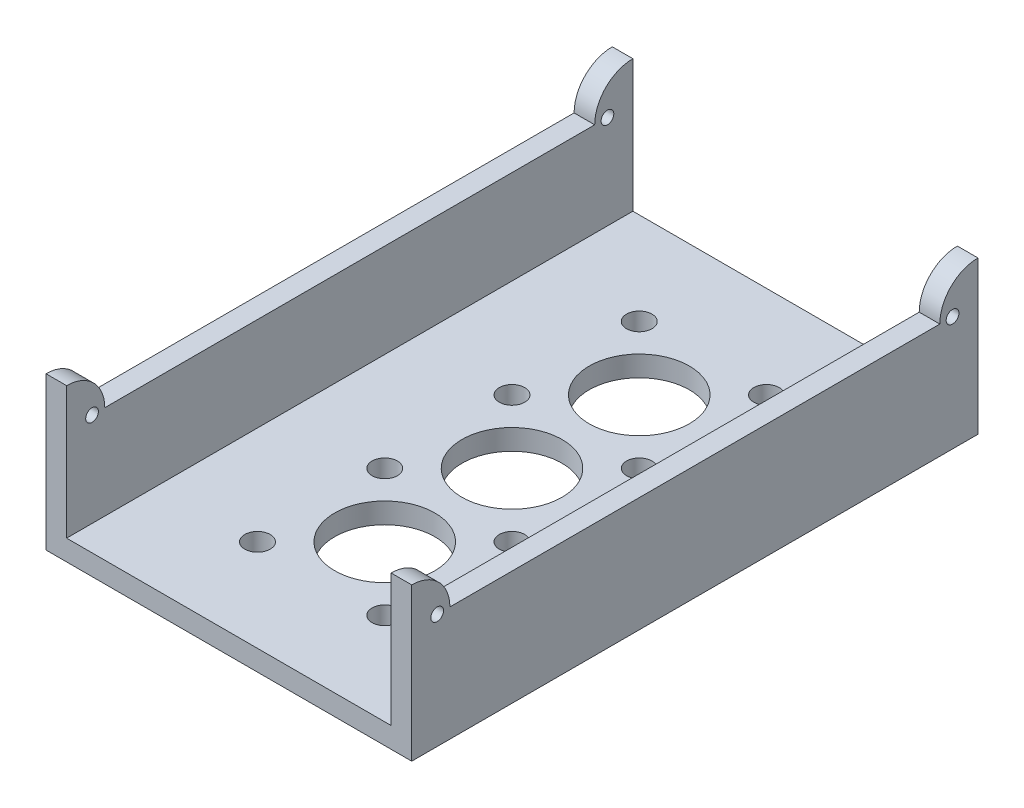
ISO-10303-21;
HEADER;
FILE_DESCRIPTION(('STEP AP214'),'2;1');
FILE_NAME('part.step','',(''),(''),'','','');
FILE_SCHEMA(('AUTOMOTIVE_DESIGN { 1 0 10303 214 1 1 1 1 }'));
ENDSEC;
DATA;
#1=APPLICATION_CONTEXT('core data for automotive mechanical design processes');
#2=APPLICATION_PROTOCOL_DEFINITION('international standard','automotive_design',2000,#1);
#3=PRODUCT_CONTEXT('',#1,'mechanical');
#4=PRODUCT('Part','Part','',(#3));
#5=PRODUCT_RELATED_PRODUCT_CATEGORY('part','',(#4));
#6=PRODUCT_DEFINITION_FORMATION('','',#4);
#7=PRODUCT_DEFINITION_CONTEXT('part definition',#1,'design');
#8=PRODUCT_DEFINITION('design','',#6,#7);
#9=PRODUCT_DEFINITION_SHAPE('','',#8);
#10=(LENGTH_UNIT() NAMED_UNIT(*) SI_UNIT(.MILLI.,.METRE.));
#11=(NAMED_UNIT(*) PLANE_ANGLE_UNIT() SI_UNIT($,.RADIAN.));
#12=(NAMED_UNIT(*) SI_UNIT($,.STERADIAN.) SOLID_ANGLE_UNIT());
#13=UNCERTAINTY_MEASURE_WITH_UNIT(LENGTH_MEASURE(1.E-05),#10,'distance_accuracy_value','');
#14=(GEOMETRIC_REPRESENTATION_CONTEXT(3) GLOBAL_UNCERTAINTY_ASSIGNED_CONTEXT((#13)) GLOBAL_UNIT_ASSIGNED_CONTEXT((#10,
#11,#12)) REPRESENTATION_CONTEXT('',''));
#15=CARTESIAN_POINT('',(0.,0.,0.));
#16=DIRECTION('',(0.,0.,1.));
#17=DIRECTION('',(1.,0.,0.));
#18=AXIS2_PLACEMENT_3D('',#15,#16,#17);
#19=CARTESIAN_POINT('',(14.37,0.,44.5));
#20=DIRECTION('',(1.,0.,0.));
#21=DIRECTION('',(0.,0.,-1.));
#22=AXIS2_PLACEMENT_3D('',#19,#20,#21);
#23=PLANE('',#22);
#24=CARTESIAN_POINT('',(14.37,9.,2.));
#25=DIRECTION('',(-1.,0.,0.));
#26=DIRECTION('',(0.,0.,1.));
#27=AXIS2_PLACEMENT_3D('',#24,#25,#26);
#28=CIRCLE('',#27,0.499999999999999);
#29=CARTESIAN_POINT('',(14.37,9.,2.5));
#30=VERTEX_POINT('',#29);
#31=EDGE_CURVE('E267',#30,#30,#28,.T.);
#32=ORIENTED_EDGE('',*,*,#31,.T.);
#33=EDGE_LOOP('',(#32));
#34=FACE_BOUND('',#33,.T.);
#35=CARTESIAN_POINT('',(14.37,9.,42.5));
#36=DIRECTION('',(-1.,0.,0.));
#37=DIRECTION('',(0.,0.,1.));
#38=AXIS2_PLACEMENT_3D('',#35,#36,#37);
#39=CIRCLE('',#38,0.499999999999999);
#40=CARTESIAN_POINT('',(14.37,9.,43.));
#41=VERTEX_POINT('',#40);
#42=EDGE_CURVE('E268',#41,#41,#39,.T.);
#43=ORIENTED_EDGE('',*,*,#42,.T.);
#44=EDGE_LOOP('',(#43));
#45=FACE_BOUND('',#44,.T.);
#46=DIRECTION('',(0.,-1.,0.));
#47=VECTOR('',#46,1.);
#48=CARTESIAN_POINT('',(14.37,0.,0.));
#49=LINE('',#48,#47);
#50=CARTESIAN_POINT('',(14.37,12.,0.));
#51=VERTEX_POINT('',#50);
#52=CARTESIAN_POINT('',(14.37,0.,0.));
#53=VERTEX_POINT('',#52);
#54=EDGE_CURVE('E102',#51,#53,#49,.T.);
#55=ORIENTED_EDGE('',*,*,#54,.F.);
#56=CARTESIAN_POINT('',(14.37,9.,0.));
#57=DIRECTION('',(1.,0.,0.));
#58=DIRECTION('',(0.,0.,-1.));
#59=AXIS2_PLACEMENT_3D('',#56,#57,#58);
#60=CIRCLE('',#59,3.);
#61=CARTESIAN_POINT('',(14.37,9.,3.));
#62=VERTEX_POINT('',#61);
#63=EDGE_CURVE('E254',#51,#62,#60,.T.);
#64=ORIENTED_EDGE('',*,*,#63,.T.);
#65=DIRECTION('',(0.,0.,1.));
#66=VECTOR('',#65,1.);
#67=CARTESIAN_POINT('',(14.37,9.,3.));
#68=LINE('',#67,#66);
#69=CARTESIAN_POINT('',(14.37,9.,41.5));
#70=VERTEX_POINT('',#69);
#71=EDGE_CURVE('E133',#62,#70,#68,.T.);
#72=ORIENTED_EDGE('',*,*,#71,.T.);
#73=CARTESIAN_POINT('',(14.37,9.,44.5));
#74=DIRECTION('',(1.,0.,0.));
#75=DIRECTION('',(0.,0.,-1.));
#76=AXIS2_PLACEMENT_3D('',#73,#74,#75);
#77=CIRCLE('',#76,3.);
#78=CARTESIAN_POINT('',(14.37,12.,44.5));
#79=VERTEX_POINT('',#78);
#80=EDGE_CURVE('E257',#70,#79,#77,.T.);
#81=ORIENTED_EDGE('',*,*,#80,.T.);
#82=DIRECTION('',(0.,-1.,0.));
#83=VECTOR('',#82,1.);
#84=CARTESIAN_POINT('',(14.37,0.,44.5));
#85=LINE('',#84,#83);
#86=CARTESIAN_POINT('',(14.37,0.,44.5));
#87=VERTEX_POINT('',#86);
#88=EDGE_CURVE('E144',#79,#87,#85,.T.);
#89=ORIENTED_EDGE('',*,*,#88,.T.);
#90=DIRECTION('',(0.,0.,-1.));
#91=VECTOR('',#90,1.);
#92=CARTESIAN_POINT('',(14.37,0.,44.5));
#93=LINE('',#92,#91);
#94=EDGE_CURVE('E158',#87,#53,#93,.T.);
#95=ORIENTED_EDGE('',*,*,#94,.T.);
#96=EDGE_LOOP('',(#55,#64,#72,#81,#89,#95));
#97=FACE_BOUND('',#96,.T.);
#98=ADVANCED_FACE('F32',(#34,#45,#97),#23,.T.);
#99=CARTESIAN_POINT('',(12.75,12.,44.5));
#100=DIRECTION('',(-1.,0.,0.));
#101=DIRECTION('',(0.,-1.,0.));
#102=AXIS2_PLACEMENT_3D('',#99,#100,#101);
#103=PLANE('',#102);
#104=CARTESIAN_POINT('',(12.75,9.,2.));
#105=DIRECTION('',(-1.,0.,0.));
#106=DIRECTION('',(0.,-1.,0.));
#107=AXIS2_PLACEMENT_3D('',#104,#105,#106);
#108=CIRCLE('',#107,0.499999999999999);
#109=CARTESIAN_POINT('',(12.75,8.5,2.));
#110=VERTEX_POINT('',#109);
#111=EDGE_CURVE('E258',#110,#110,#108,.F.);
#112=ORIENTED_EDGE('',*,*,#111,.T.);
#113=EDGE_LOOP('',(#112));
#114=FACE_BOUND('',#113,.T.);
#115=CARTESIAN_POINT('',(12.75,9.,42.5));
#116=DIRECTION('',(-1.,0.,0.));
#117=DIRECTION('',(0.,-1.,0.));
#118=AXIS2_PLACEMENT_3D('',#115,#116,#117);
#119=CIRCLE('',#118,0.499999999999999);
#120=CARTESIAN_POINT('',(12.75,8.5,42.5));
#121=VERTEX_POINT('',#120);
#122=EDGE_CURVE('E264',#121,#121,#119,.F.);
#123=ORIENTED_EDGE('',*,*,#122,.T.);
#124=EDGE_LOOP('',(#123));
#125=FACE_BOUND('',#124,.T.);
#126=DIRECTION('',(0.,0.,-1.));
#127=VECTOR('',#126,1.);
#128=CARTESIAN_POINT('',(12.75,9.,44.5));
#129=LINE('',#128,#127);
#130=CARTESIAN_POINT('',(12.75,9.,41.5));
#131=VERTEX_POINT('',#130);
#132=CARTESIAN_POINT('',(12.75,9.,3.));
#133=VERTEX_POINT('',#132);
#134=EDGE_CURVE('E40',#131,#133,#129,.T.);
#135=ORIENTED_EDGE('',*,*,#134,.T.);
#136=CARTESIAN_POINT('',(12.75,9.,0.));
#137=DIRECTION('',(-1.,0.,0.));
#138=DIRECTION('',(0.,-1.,0.));
#139=AXIS2_PLACEMENT_3D('',#136,#137,#138);
#140=CIRCLE('',#139,3.);
#141=CARTESIAN_POINT('',(12.75,12.,0.));
#142=VERTEX_POINT('',#141);
#143=EDGE_CURVE('E11',#133,#142,#140,.T.);
#144=ORIENTED_EDGE('',*,*,#143,.T.);
#145=DIRECTION('',(0.,1.,0.));
#146=VECTOR('',#145,1.);
#147=CARTESIAN_POINT('',(12.75,12.,0.));
#148=LINE('',#147,#146);
#149=CARTESIAN_POINT('',(12.75,1.62,0.));
#150=VERTEX_POINT('',#149);
#151=EDGE_CURVE('E148',#150,#142,#148,.T.);
#152=ORIENTED_EDGE('',*,*,#151,.F.);
#153=DIRECTION('',(0.,0.,-1.));
#154=VECTOR('',#153,1.);
#155=CARTESIAN_POINT('',(12.75,1.62,44.5));
#156=LINE('',#155,#154);
#157=CARTESIAN_POINT('',(12.75,1.62,44.5));
#158=VERTEX_POINT('',#157);
#159=EDGE_CURVE('E152',#158,#150,#156,.T.);
#160=ORIENTED_EDGE('',*,*,#159,.F.);
#161=DIRECTION('',(0.,1.,0.));
#162=VECTOR('',#161,1.);
#163=CARTESIAN_POINT('',(12.75,12.,44.5));
#164=LINE('',#163,#162);
#165=CARTESIAN_POINT('',(12.75,12.,44.5));
#166=VERTEX_POINT('',#165);
#167=EDGE_CURVE('E151',#158,#166,#164,.T.);
#168=ORIENTED_EDGE('',*,*,#167,.T.);
#169=CARTESIAN_POINT('',(12.75,9.,44.5));
#170=DIRECTION('',(-1.,0.,0.));
#171=DIRECTION('',(0.,-1.,0.));
#172=AXIS2_PLACEMENT_3D('',#169,#170,#171);
#173=CIRCLE('',#172,3.);
#174=EDGE_CURVE('E111',#166,#131,#173,.T.);
#175=ORIENTED_EDGE('',*,*,#174,.T.);
#176=EDGE_LOOP('',(#135,#144,#152,#160,#168,#175));
#177=FACE_BOUND('',#176,.T.);
#178=ADVANCED_FACE('F116',(#114,#125,#177),#103,.T.);
#179=CARTESIAN_POINT('',(-12.75,1.62,44.5));
#180=DIRECTION('',(0.,-1.,0.));
#181=DIRECTION('',(1.,0.,0.));
#182=AXIS2_PLACEMENT_3D('',#179,#180,#181);
#183=PLANE('',#182);
#184=CARTESIAN_POINT('',(-5.,1.62,7.24999999999998));
#185=DIRECTION('',(0.,-1.,0.));
#186=DIRECTION('',(1.,0.,0.));
#187=AXIS2_PLACEMENT_3D('',#184,#185,#186);
#188=CIRCLE('',#187,1.);
#189=CARTESIAN_POINT('',(-4.,1.62,7.24999999999998));
#190=VERTEX_POINT('',#189);
#191=EDGE_CURVE('E279',#190,#190,#188,.F.);
#192=ORIENTED_EDGE('',*,*,#191,.F.);
#193=EDGE_LOOP('',(#192));
#194=FACE_BOUND('',#193,.T.);
#195=CARTESIAN_POINT('',(5.,1.62,7.24999999999998));
#196=DIRECTION('',(0.,-1.,0.));
#197=DIRECTION('',(1.,0.,0.));
#198=AXIS2_PLACEMENT_3D('',#195,#196,#197);
#199=CIRCLE('',#198,1.);
#200=CARTESIAN_POINT('',(6.,1.62,7.24999999999998));
#201=VERTEX_POINT('',#200);
#202=EDGE_CURVE('E282',#201,#201,#199,.F.);
#203=ORIENTED_EDGE('',*,*,#202,.F.);
#204=EDGE_LOOP('',(#203));
#205=FACE_BOUND('',#204,.T.);
#206=CARTESIAN_POINT('',(5.,1.62,17.25));
#207=DIRECTION('',(0.,-1.,0.));
#208=DIRECTION('',(1.,0.,0.));
#209=AXIS2_PLACEMENT_3D('',#206,#207,#208);
#210=CIRCLE('',#209,1.);
#211=CARTESIAN_POINT('',(6.,1.62,17.25));
#212=VERTEX_POINT('',#211);
#213=EDGE_CURVE('E285',#212,#212,#210,.F.);
#214=ORIENTED_EDGE('',*,*,#213,.F.);
#215=EDGE_LOOP('',(#214));
#216=FACE_BOUND('',#215,.T.);
#217=CARTESIAN_POINT('',(-5.,1.62,17.25));
#218=DIRECTION('',(0.,-1.,0.));
#219=DIRECTION('',(1.,0.,0.));
#220=AXIS2_PLACEMENT_3D('',#217,#218,#219);
#221=CIRCLE('',#220,1.);
#222=CARTESIAN_POINT('',(-4.,1.62,17.25));
#223=VERTEX_POINT('',#222);
#224=EDGE_CURVE('E288',#223,#223,#221,.F.);
#225=ORIENTED_EDGE('',*,*,#224,.F.);
#226=EDGE_LOOP('',(#225));
#227=FACE_BOUND('',#226,.T.);
#228=CARTESIAN_POINT('',(1.06244632494249E-13,1.62,22.25));
#229=DIRECTION('',(0.,-1.,0.));
#230=DIRECTION('',(1.,0.,0.));
#231=AXIS2_PLACEMENT_3D('',#228,#229,#230);
#232=CIRCLE('',#231,3.935);
#233=CARTESIAN_POINT('',(3.93500000000011,1.62,22.25));
#234=VERTEX_POINT('',#233);
#235=EDGE_CURVE('E291',#234,#234,#232,.F.);
#236=ORIENTED_EDGE('',*,*,#235,.F.);
#237=EDGE_LOOP('',(#236));
#238=FACE_BOUND('',#237,.T.);
#239=CARTESIAN_POINT('',(5.00000000000011,1.62,27.25));
#240=DIRECTION('',(0.,-1.,0.));
#241=DIRECTION('',(1.,0.,0.));
#242=AXIS2_PLACEMENT_3D('',#239,#240,#241);
#243=CIRCLE('',#242,1.);
#244=CARTESIAN_POINT('',(6.00000000000011,1.62,27.25));
#245=VERTEX_POINT('',#244);
#246=EDGE_CURVE('E294',#245,#245,#243,.F.);
#247=ORIENTED_EDGE('',*,*,#246,.F.);
#248=EDGE_LOOP('',(#247));
#249=FACE_BOUND('',#248,.T.);
#250=CARTESIAN_POINT('',(-4.99999999999989,1.62,27.25));
#251=DIRECTION('',(0.,-1.,0.));
#252=DIRECTION('',(1.,0.,0.));
#253=AXIS2_PLACEMENT_3D('',#250,#251,#252);
#254=CIRCLE('',#253,1.);
#255=CARTESIAN_POINT('',(-3.99999999999989,1.62,27.25));
#256=VERTEX_POINT('',#255);
#257=EDGE_CURVE('E297',#256,#256,#254,.F.);
#258=ORIENTED_EDGE('',*,*,#257,.F.);
#259=EDGE_LOOP('',(#258));
#260=FACE_BOUND('',#259,.T.);
#261=CARTESIAN_POINT('',(2.10989072659543E-13,1.62,32.25));
#262=DIRECTION('',(0.,-1.,0.));
#263=DIRECTION('',(1.,0.,0.));
#264=AXIS2_PLACEMENT_3D('',#261,#262,#263);
#265=CIRCLE('',#264,3.935);
#266=CARTESIAN_POINT('',(3.93500000000021,1.62,32.25));
#267=VERTEX_POINT('',#266);
#268=EDGE_CURVE('E300',#267,#267,#265,.F.);
#269=ORIENTED_EDGE('',*,*,#268,.F.);
#270=EDGE_LOOP('',(#269));
#271=FACE_BOUND('',#270,.T.);
#272=CARTESIAN_POINT('',(5.00000000000021,1.62,37.25));
#273=DIRECTION('',(0.,-1.,0.));
#274=DIRECTION('',(1.,0.,0.));
#275=AXIS2_PLACEMENT_3D('',#272,#273,#274);
#276=CIRCLE('',#275,1.);
#277=CARTESIAN_POINT('',(6.00000000000021,1.62,37.25));
#278=VERTEX_POINT('',#277);
#279=EDGE_CURVE('E303',#278,#278,#276,.F.);
#280=ORIENTED_EDGE('',*,*,#279,.F.);
#281=EDGE_LOOP('',(#280));
#282=FACE_BOUND('',#281,.T.);
#283=CARTESIAN_POINT('',(-4.99999999999979,1.62,37.25));
#284=DIRECTION('',(0.,-1.,0.));
#285=DIRECTION('',(1.,0.,0.));
#286=AXIS2_PLACEMENT_3D('',#283,#284,#285);
#287=CIRCLE('',#286,1.);
#288=CARTESIAN_POINT('',(-3.99999999999979,1.62,37.25));
#289=VERTEX_POINT('',#288);
#290=EDGE_CURVE('E306',#289,#289,#287,.F.);
#291=ORIENTED_EDGE('',*,*,#290,.F.);
#292=EDGE_LOOP('',(#291));
#293=FACE_BOUND('',#292,.T.);
#294=CARTESIAN_POINT('',(0.,1.62,12.25));
#295=DIRECTION('',(0.,-1.,0.));
#296=DIRECTION('',(1.,0.,0.));
#297=AXIS2_PLACEMENT_3D('',#294,#295,#296);
#298=CIRCLE('',#297,3.935);
#299=CARTESIAN_POINT('',(3.935,1.62,12.25));
#300=VERTEX_POINT('',#299);
#301=EDGE_CURVE('E271',#300,#300,#298,.F.);
#302=ORIENTED_EDGE('',*,*,#301,.F.);
#303=EDGE_LOOP('',(#302));
#304=FACE_BOUND('',#303,.T.);
#305=DIRECTION('',(-1.,0.,0.));
#306=VECTOR('',#305,1.);
#307=CARTESIAN_POINT('',(-12.75,1.62,0.));
#308=LINE('',#307,#306);
#309=CARTESIAN_POINT('',(-12.75,1.62,0.));
#310=VERTEX_POINT('',#309);
#311=EDGE_CURVE('E193',#150,#310,#308,.T.);
#312=ORIENTED_EDGE('',*,*,#311,.T.);
#313=DIRECTION('',(0.,0.,-1.));
#314=VECTOR('',#313,1.);
#315=CARTESIAN_POINT('',(-12.75,1.62,44.5));
#316=LINE('',#315,#314);
#317=CARTESIAN_POINT('',(-12.75,1.62,44.5));
#318=VERTEX_POINT('',#317);
#319=EDGE_CURVE('E95',#318,#310,#316,.T.);
#320=ORIENTED_EDGE('',*,*,#319,.F.);
#321=DIRECTION('',(-1.,0.,0.));
#322=VECTOR('',#321,1.);
#323=CARTESIAN_POINT('',(-12.75,1.62,44.5));
#324=LINE('',#323,#322);
#325=EDGE_CURVE('E103',#158,#318,#324,.T.);
#326=ORIENTED_EDGE('',*,*,#325,.F.);
#327=ORIENTED_EDGE('',*,*,#159,.T.);
#328=EDGE_LOOP('',(#312,#320,#326,#327));
#329=FACE_BOUND('',#328,.T.);
#330=ADVANCED_FACE('F34',(#194,#205,#216,#227,#238,#249,#260,#271,#282,#293,#304,#329),#183,.F.);
#331=CARTESIAN_POINT('',(-12.75,12.,44.5));
#332=DIRECTION('',(-1.,0.,0.));
#333=DIRECTION('',(0.,-1.,0.));
#334=AXIS2_PLACEMENT_3D('',#331,#332,#333);
#335=PLANE('',#334);
#336=CARTESIAN_POINT('',(-12.75,9.,2.));
#337=DIRECTION('',(-1.,0.,0.));
#338=DIRECTION('',(0.,-1.,0.));
#339=AXIS2_PLACEMENT_3D('',#336,#337,#338);
#340=CIRCLE('',#339,0.499999999999999);
#341=CARTESIAN_POINT('',(-12.75,8.5,2.));
#342=VERTEX_POINT('',#341);
#343=EDGE_CURVE('E169',#342,#342,#340,.T.);
#344=ORIENTED_EDGE('',*,*,#343,.T.);
#345=EDGE_LOOP('',(#344));
#346=FACE_BOUND('',#345,.T.);
#347=CARTESIAN_POINT('',(-12.75,9.,42.5));
#348=DIRECTION('',(-1.,0.,0.));
#349=DIRECTION('',(0.,-1.,0.));
#350=AXIS2_PLACEMENT_3D('',#347,#348,#349);
#351=CIRCLE('',#350,0.499999999999999);
#352=CARTESIAN_POINT('',(-12.75,8.5,42.5));
#353=VERTEX_POINT('',#352);
#354=EDGE_CURVE('E164',#353,#353,#351,.T.);
#355=ORIENTED_EDGE('',*,*,#354,.T.);
#356=EDGE_LOOP('',(#355));
#357=FACE_BOUND('',#356,.T.);
#358=DIRECTION('',(0.,1.,0.));
#359=VECTOR('',#358,1.);
#360=CARTESIAN_POINT('',(-12.75,12.,0.));
#361=LINE('',#360,#359);
#362=CARTESIAN_POINT('',(-12.75,12.,0.));
#363=VERTEX_POINT('',#362);
#364=EDGE_CURVE('E202',#310,#363,#361,.T.);
#365=ORIENTED_EDGE('',*,*,#364,.T.);
#366=CARTESIAN_POINT('',(-12.75,9.,0.));
#367=DIRECTION('',(-1.,0.,0.));
#368=DIRECTION('',(0.,-1.,0.));
#369=AXIS2_PLACEMENT_3D('',#366,#367,#368);
#370=CIRCLE('',#369,3.);
#371=CARTESIAN_POINT('',(-12.75,9.,3.));
#372=VERTEX_POINT('',#371);
#373=EDGE_CURVE('E183',#363,#372,#370,.F.);
#374=ORIENTED_EDGE('',*,*,#373,.T.);
#375=DIRECTION('',(0.,0.,1.));
#376=VECTOR('',#375,1.);
#377=CARTESIAN_POINT('',(-12.75,9.,44.5));
#378=LINE('',#377,#376);
#379=CARTESIAN_POINT('',(-12.75,9.,41.5));
#380=VERTEX_POINT('',#379);
#381=EDGE_CURVE('E191',#372,#380,#378,.T.);
#382=ORIENTED_EDGE('',*,*,#381,.T.);
#383=CARTESIAN_POINT('',(-12.75,9.,44.5));
#384=DIRECTION('',(-1.,0.,0.));
#385=DIRECTION('',(0.,-1.,0.));
#386=AXIS2_PLACEMENT_3D('',#383,#384,#385);
#387=CIRCLE('',#386,3.);
#388=CARTESIAN_POINT('',(-12.75,12.,44.5));
#389=VERTEX_POINT('',#388);
#390=EDGE_CURVE('E188',#380,#389,#387,.F.);
#391=ORIENTED_EDGE('',*,*,#390,.T.);
#392=DIRECTION('',(0.,1.,0.));
#393=VECTOR('',#392,1.);
#394=CARTESIAN_POINT('',(-12.75,12.,44.5));
#395=LINE('',#394,#393);
#396=EDGE_CURVE('E105',#318,#389,#395,.T.);
#397=ORIENTED_EDGE('',*,*,#396,.F.);
#398=ORIENTED_EDGE('',*,*,#319,.T.);
#399=EDGE_LOOP('',(#365,#374,#382,#391,#397,#398));
#400=FACE_BOUND('',#399,.T.);
#401=ADVANCED_FACE('F215',(#346,#357,#400),#335,.F.);
#402=CARTESIAN_POINT('',(-14.37,0.,44.5));
#403=DIRECTION('',(1.,0.,0.));
#404=DIRECTION('',(0.,0.,-1.));
#405=AXIS2_PLACEMENT_3D('',#402,#403,#404);
#406=PLANE('',#405);
#407=CARTESIAN_POINT('',(-14.37,9.,2.));
#408=DIRECTION('',(-1.,0.,0.));
#409=DIRECTION('',(0.,0.,1.));
#410=AXIS2_PLACEMENT_3D('',#407,#408,#409);
#411=CIRCLE('',#410,0.499999999999999);
#412=CARTESIAN_POINT('',(-14.37,9.,2.5));
#413=VERTEX_POINT('',#412);
#414=EDGE_CURVE('E161',#413,#413,#411,.T.);
#415=ORIENTED_EDGE('',*,*,#414,.F.);
#416=EDGE_LOOP('',(#415));
#417=FACE_BOUND('',#416,.T.);
#418=CARTESIAN_POINT('',(-14.37,9.,42.5));
#419=DIRECTION('',(-1.,0.,0.));
#420=DIRECTION('',(0.,0.,1.));
#421=AXIS2_PLACEMENT_3D('',#418,#419,#420);
#422=CIRCLE('',#421,0.499999999999999);
#423=CARTESIAN_POINT('',(-14.37,9.,43.));
#424=VERTEX_POINT('',#423);
#425=EDGE_CURVE('E160',#424,#424,#422,.T.);
#426=ORIENTED_EDGE('',*,*,#425,.F.);
#427=EDGE_LOOP('',(#426));
#428=FACE_BOUND('',#427,.T.);
#429=DIRECTION('',(0.,0.,1.));
#430=VECTOR('',#429,1.);
#431=CARTESIAN_POINT('',(-14.37,9.,3.));
#432=LINE('',#431,#430);
#433=CARTESIAN_POINT('',(-14.37,9.,3.));
#434=VERTEX_POINT('',#433);
#435=CARTESIAN_POINT('',(-14.37,9.,41.5));
#436=VERTEX_POINT('',#435);
#437=EDGE_CURVE('E173',#434,#436,#432,.T.);
#438=ORIENTED_EDGE('',*,*,#437,.F.);
#439=CARTESIAN_POINT('',(-14.37,9.,0.));
#440=DIRECTION('',(1.,0.,0.));
#441=DIRECTION('',(0.,0.,-1.));
#442=AXIS2_PLACEMENT_3D('',#439,#440,#441);
#443=CIRCLE('',#442,3.);
#444=CARTESIAN_POINT('',(-14.37,12.,0.));
#445=VERTEX_POINT('',#444);
#446=EDGE_CURVE('E81',#445,#434,#443,.T.);
#447=ORIENTED_EDGE('',*,*,#446,.F.);
#448=DIRECTION('',(0.,-1.,0.));
#449=VECTOR('',#448,1.);
#450=CARTESIAN_POINT('',(-14.37,0.,0.));
#451=LINE('',#450,#449);
#452=CARTESIAN_POINT('',(-14.37,0.,0.));
#453=VERTEX_POINT('',#452);
#454=EDGE_CURVE('E73',#445,#453,#451,.T.);
#455=ORIENTED_EDGE('',*,*,#454,.T.);
#456=DIRECTION('',(0.,0.,-1.));
#457=VECTOR('',#456,1.);
#458=CARTESIAN_POINT('',(-14.37,0.,44.5));
#459=LINE('',#458,#457);
#460=CARTESIAN_POINT('',(-14.37,0.,44.5));
#461=VERTEX_POINT('',#460);
#462=EDGE_CURVE('E77',#461,#453,#459,.T.);
#463=ORIENTED_EDGE('',*,*,#462,.F.);
#464=DIRECTION('',(0.,-1.,0.));
#465=VECTOR('',#464,1.);
#466=CARTESIAN_POINT('',(-14.37,0.,44.5));
#467=LINE('',#466,#465);
#468=CARTESIAN_POINT('',(-14.37,12.,44.5));
#469=VERTEX_POINT('',#468);
#470=EDGE_CURVE('E56',#469,#461,#467,.T.);
#471=ORIENTED_EDGE('',*,*,#470,.F.);
#472=CARTESIAN_POINT('',(-14.37,9.,44.5));
#473=DIRECTION('',(1.,0.,0.));
#474=DIRECTION('',(0.,0.,-1.));
#475=AXIS2_PLACEMENT_3D('',#472,#473,#474);
#476=CIRCLE('',#475,3.);
#477=EDGE_CURVE('E176',#436,#469,#476,.T.);
#478=ORIENTED_EDGE('',*,*,#477,.F.);
#479=EDGE_LOOP('',(#438,#447,#455,#463,#471,#478));
#480=FACE_BOUND('',#479,.T.);
#481=ADVANCED_FACE('F76',(#417,#428,#480),#406,.F.);
#482=CARTESIAN_POINT('',(0.,0.,44.5));
#483=DIRECTION('',(0.,1.,0.));
#484=DIRECTION('',(-1.,0.,0.));
#485=AXIS2_PLACEMENT_3D('',#482,#483,#484);
#486=PLANE('',#485);
#487=CARTESIAN_POINT('',(-5.,0.,7.24999999999998));
#488=DIRECTION('',(0.,1.,0.));
#489=DIRECTION('',(0.,0.,1.));
#490=AXIS2_PLACEMENT_3D('',#487,#488,#489);
#491=CIRCLE('',#490,1.);
#492=CARTESIAN_POINT('',(-5.,0.,8.24999999999998));
#493=VERTEX_POINT('',#492);
#494=EDGE_CURVE('E309',#493,#493,#491,.T.);
#495=ORIENTED_EDGE('',*,*,#494,.T.);
#496=EDGE_LOOP('',(#495));
#497=FACE_BOUND('',#496,.T.);
#498=CARTESIAN_POINT('',(5.,0.,7.24999999999998));
#499=DIRECTION('',(0.,1.,0.));
#500=DIRECTION('',(0.,0.,1.));
#501=AXIS2_PLACEMENT_3D('',#498,#499,#500);
#502=CIRCLE('',#501,1.);
#503=CARTESIAN_POINT('',(5.,0.,8.24999999999998));
#504=VERTEX_POINT('',#503);
#505=EDGE_CURVE('E334',#504,#504,#502,.T.);
#506=ORIENTED_EDGE('',*,*,#505,.T.);
#507=EDGE_LOOP('',(#506));
#508=FACE_BOUND('',#507,.T.);
#509=CARTESIAN_POINT('',(5.,0.,17.25));
#510=DIRECTION('',(0.,1.,0.));
#511=DIRECTION('',(0.,0.,1.));
#512=AXIS2_PLACEMENT_3D('',#509,#510,#511);
#513=CIRCLE('',#512,1.);
#514=CARTESIAN_POINT('',(5.,0.,18.25));
#515=VERTEX_POINT('',#514);
#516=EDGE_CURVE('E331',#515,#515,#513,.T.);
#517=ORIENTED_EDGE('',*,*,#516,.T.);
#518=EDGE_LOOP('',(#517));
#519=FACE_BOUND('',#518,.T.);
#520=CARTESIAN_POINT('',(-5.,0.,17.25));
#521=DIRECTION('',(0.,1.,0.));
#522=DIRECTION('',(0.,0.,1.));
#523=AXIS2_PLACEMENT_3D('',#520,#521,#522);
#524=CIRCLE('',#523,1.);
#525=CARTESIAN_POINT('',(-5.,0.,18.25));
#526=VERTEX_POINT('',#525);
#527=EDGE_CURVE('E328',#526,#526,#524,.T.);
#528=ORIENTED_EDGE('',*,*,#527,.T.);
#529=EDGE_LOOP('',(#528));
#530=FACE_BOUND('',#529,.T.);
#531=CARTESIAN_POINT('',(1.06244632494249E-13,0.,22.25));
#532=DIRECTION('',(0.,1.,0.));
#533=DIRECTION('',(0.,0.,1.));
#534=AXIS2_PLACEMENT_3D('',#531,#532,#533);
#535=CIRCLE('',#534,3.935);
#536=CARTESIAN_POINT('',(1.06244632494249E-13,0.,26.185));
#537=VERTEX_POINT('',#536);
#538=EDGE_CURVE('E325',#537,#537,#535,.T.);
#539=ORIENTED_EDGE('',*,*,#538,.T.);
#540=EDGE_LOOP('',(#539));
#541=FACE_BOUND('',#540,.T.);
#542=CARTESIAN_POINT('',(5.00000000000011,0.,27.25));
#543=DIRECTION('',(0.,1.,0.));
#544=DIRECTION('',(0.,0.,1.));
#545=AXIS2_PLACEMENT_3D('',#542,#543,#544);
#546=CIRCLE('',#545,1.);
#547=CARTESIAN_POINT('',(5.00000000000011,0.,28.25));
#548=VERTEX_POINT('',#547);
#549=EDGE_CURVE('E322',#548,#548,#546,.T.);
#550=ORIENTED_EDGE('',*,*,#549,.T.);
#551=EDGE_LOOP('',(#550));
#552=FACE_BOUND('',#551,.T.);
#553=CARTESIAN_POINT('',(-4.99999999999989,0.,27.25));
#554=DIRECTION('',(0.,1.,0.));
#555=DIRECTION('',(0.,0.,1.));
#556=AXIS2_PLACEMENT_3D('',#553,#554,#555);
#557=CIRCLE('',#556,1.);
#558=CARTESIAN_POINT('',(-4.99999999999989,0.,28.25));
#559=VERTEX_POINT('',#558);
#560=EDGE_CURVE('E319',#559,#559,#557,.T.);
#561=ORIENTED_EDGE('',*,*,#560,.T.);
#562=EDGE_LOOP('',(#561));
#563=FACE_BOUND('',#562,.T.);
#564=CARTESIAN_POINT('',(2.10989072659543E-13,0.,32.25));
#565=DIRECTION('',(0.,1.,0.));
#566=DIRECTION('',(0.,0.,1.));
#567=AXIS2_PLACEMENT_3D('',#564,#565,#566);
#568=CIRCLE('',#567,3.935);
#569=CARTESIAN_POINT('',(2.10989072659543E-13,0.,36.185));
#570=VERTEX_POINT('',#569);
#571=EDGE_CURVE('E316',#570,#570,#568,.T.);
#572=ORIENTED_EDGE('',*,*,#571,.T.);
#573=EDGE_LOOP('',(#572));
#574=FACE_BOUND('',#573,.T.);
#575=CARTESIAN_POINT('',(5.00000000000021,0.,37.25));
#576=DIRECTION('',(0.,1.,0.));
#577=DIRECTION('',(0.,0.,1.));
#578=AXIS2_PLACEMENT_3D('',#575,#576,#577);
#579=CIRCLE('',#578,1.);
#580=CARTESIAN_POINT('',(5.00000000000021,0.,38.25));
#581=VERTEX_POINT('',#580);
#582=EDGE_CURVE('E313',#581,#581,#579,.T.);
#583=ORIENTED_EDGE('',*,*,#582,.T.);
#584=EDGE_LOOP('',(#583));
#585=FACE_BOUND('',#584,.T.);
#586=CARTESIAN_POINT('',(-4.99999999999979,0.,37.25));
#587=DIRECTION('',(0.,1.,0.));
#588=DIRECTION('',(0.,0.,1.));
#589=AXIS2_PLACEMENT_3D('',#586,#587,#588);
#590=CIRCLE('',#589,1.);
#591=CARTESIAN_POINT('',(-4.99999999999979,0.,38.25));
#592=VERTEX_POINT('',#591);
#593=EDGE_CURVE('E310',#592,#592,#590,.T.);
#594=ORIENTED_EDGE('',*,*,#593,.T.);
#595=EDGE_LOOP('',(#594));
#596=FACE_BOUND('',#595,.T.);
#597=CARTESIAN_POINT('',(0.,0.,12.25));
#598=DIRECTION('',(0.,1.,0.));
#599=DIRECTION('',(0.,0.,1.));
#600=AXIS2_PLACEMENT_3D('',#597,#598,#599);
#601=CIRCLE('',#600,3.935);
#602=CARTESIAN_POINT('',(0.,0.,16.185));
#603=VERTEX_POINT('',#602);
#604=EDGE_CURVE('E276',#603,#603,#601,.T.);
#605=ORIENTED_EDGE('',*,*,#604,.T.);
#606=EDGE_LOOP('',(#605));
#607=FACE_BOUND('',#606,.T.);
#608=DIRECTION('',(1.,0.,0.));
#609=VECTOR('',#608,1.);
#610=CARTESIAN_POINT('',(0.,0.,0.));
#611=LINE('',#610,#609);
#612=EDGE_CURVE('E85',#453,#53,#611,.T.);
#613=ORIENTED_EDGE('',*,*,#612,.T.);
#614=ORIENTED_EDGE('',*,*,#94,.F.);
#615=DIRECTION('',(1.,0.,0.));
#616=VECTOR('',#615,1.);
#617=CARTESIAN_POINT('',(0.,0.,44.5));
#618=LINE('',#617,#616);
#619=EDGE_CURVE('E94',#461,#87,#618,.T.);
#620=ORIENTED_EDGE('',*,*,#619,.F.);
#621=ORIENTED_EDGE('',*,*,#462,.T.);
#622=EDGE_LOOP('',(#613,#614,#620,#621));
#623=FACE_BOUND('',#622,.T.);
#624=ADVANCED_FACE('F90',(#497,#508,#519,#530,#541,#552,#563,#574,#585,#596,#607,#623),#486,.F.);
#625=CARTESIAN_POINT('',(0.,0.,44.5));
#626=DIRECTION('',(0.,0.,-1.));
#627=DIRECTION('',(-1.,0.,0.));
#628=AXIS2_PLACEMENT_3D('',#625,#626,#627);
#629=PLANE('',#628);
#630=ORIENTED_EDGE('',*,*,#619,.T.);
#631=ORIENTED_EDGE('',*,*,#88,.F.);
#632=DIRECTION('',(1.,0.,0.));
#633=VECTOR('',#632,1.);
#634=CARTESIAN_POINT('',(14.37,12.,44.5));
#635=LINE('',#634,#633);
#636=EDGE_CURVE('E147',#166,#79,#635,.T.);
#637=ORIENTED_EDGE('',*,*,#636,.F.);
#638=ORIENTED_EDGE('',*,*,#167,.F.);
#639=ORIENTED_EDGE('',*,*,#325,.T.);
#640=ORIENTED_EDGE('',*,*,#396,.T.);
#641=DIRECTION('',(-1.,0.,0.));
#642=VECTOR('',#641,1.);
#643=CARTESIAN_POINT('',(-14.37,12.,44.5));
#644=LINE('',#643,#642);
#645=EDGE_CURVE('E197',#389,#469,#644,.T.);
#646=ORIENTED_EDGE('',*,*,#645,.T.);
#647=ORIENTED_EDGE('',*,*,#470,.T.);
#648=EDGE_LOOP('',(#630,#631,#637,#638,#639,#640,#646,#647));
#649=FACE_BOUND('',#648,.T.);
#650=ADVANCED_FACE('F246',(#649),#629,.F.);
#651=CARTESIAN_POINT('',(0.,0.,0.));
#652=DIRECTION('',(0.,0.,-1.));
#653=DIRECTION('',(-1.,0.,0.));
#654=AXIS2_PLACEMENT_3D('',#651,#652,#653);
#655=PLANE('',#654);
#656=ORIENTED_EDGE('',*,*,#311,.F.);
#657=ORIENTED_EDGE('',*,*,#151,.T.);
#658=DIRECTION('',(1.,0.,0.));
#659=VECTOR('',#658,1.);
#660=CARTESIAN_POINT('',(14.37,12.,0.));
#661=LINE('',#660,#659);
#662=EDGE_CURVE('E138',#142,#51,#661,.T.);
#663=ORIENTED_EDGE('',*,*,#662,.T.);
#664=ORIENTED_EDGE('',*,*,#54,.T.);
#665=ORIENTED_EDGE('',*,*,#612,.F.);
#666=ORIENTED_EDGE('',*,*,#454,.F.);
#667=DIRECTION('',(-1.,0.,0.));
#668=VECTOR('',#667,1.);
#669=CARTESIAN_POINT('',(-14.37,12.,0.));
#670=LINE('',#669,#668);
#671=EDGE_CURVE('E86',#363,#445,#670,.T.);
#672=ORIENTED_EDGE('',*,*,#671,.F.);
#673=ORIENTED_EDGE('',*,*,#364,.F.);
#674=EDGE_LOOP('',(#656,#657,#663,#664,#665,#666,#672,#673));
#675=FACE_BOUND('',#674,.T.);
#676=ADVANCED_FACE('F99',(#675),#655,.T.);
#677=CARTESIAN_POINT('',(30.13,9.,3.));
#678=DIRECTION('',(0.,-1.,0.));
#679=DIRECTION('',(0.,0.,-1.));
#680=AXIS2_PLACEMENT_3D('',#677,#678,#679);
#681=PLANE('',#680);
#682=DIRECTION('',(-1.,0.,0.));
#683=VECTOR('',#682,1.);
#684=CARTESIAN_POINT('',(30.13,9.,3.));
#685=LINE('',#684,#683);
#686=EDGE_CURVE('E179',#372,#434,#685,.T.);
#687=ORIENTED_EDGE('',*,*,#686,.T.);
#688=ORIENTED_EDGE('',*,*,#437,.T.);
#689=DIRECTION('',(-1.,0.,0.));
#690=VECTOR('',#689,1.);
#691=CARTESIAN_POINT('',(30.13,9.,41.5));
#692=LINE('',#691,#690);
#693=EDGE_CURVE('E180',#380,#436,#692,.T.);
#694=ORIENTED_EDGE('',*,*,#693,.F.);
#695=ORIENTED_EDGE('',*,*,#381,.F.);
#696=EDGE_LOOP('',(#687,#688,#694,#695));
#697=FACE_BOUND('',#696,.T.);
#698=ADVANCED_FACE('F409',(#697),#681,.F.);
#699=CARTESIAN_POINT('',(30.13,9.,44.5));
#700=DIRECTION('',(-1.,0.,0.));
#701=DIRECTION('',(0.,0.,1.));
#702=AXIS2_PLACEMENT_3D('',#699,#700,#701);
#703=CYLINDRICAL_SURFACE('',#702,3.);
#704=ORIENTED_EDGE('',*,*,#693,.T.);
#705=ORIENTED_EDGE('',*,*,#477,.T.);
#706=ORIENTED_EDGE('',*,*,#645,.F.);
#707=ORIENTED_EDGE('',*,*,#390,.F.);
#708=EDGE_LOOP('',(#704,#705,#706,#707));
#709=FACE_BOUND('',#708,.T.);
#710=ADVANCED_FACE('F243',(#709),#703,.T.);
#711=CARTESIAN_POINT('',(30.13,9.,0.));
#712=DIRECTION('',(-1.,0.,0.));
#713=DIRECTION('',(0.,0.,1.));
#714=AXIS2_PLACEMENT_3D('',#711,#712,#713);
#715=CYLINDRICAL_SURFACE('',#714,3.);
#716=ORIENTED_EDGE('',*,*,#671,.T.);
#717=ORIENTED_EDGE('',*,*,#446,.T.);
#718=ORIENTED_EDGE('',*,*,#686,.F.);
#719=ORIENTED_EDGE('',*,*,#373,.F.);
#720=EDGE_LOOP('',(#716,#717,#718,#719));
#721=FACE_BOUND('',#720,.T.);
#722=ADVANCED_FACE('F206',(#721),#715,.T.);
#723=CARTESIAN_POINT('',(30.13,9.,42.5));
#724=DIRECTION('',(-1.,0.,0.));
#725=DIRECTION('',(0.,0.,1.));
#726=AXIS2_PLACEMENT_3D('',#723,#724,#725);
#727=CYLINDRICAL_SURFACE('',#726,0.499999999999999);
#728=ORIENTED_EDGE('',*,*,#425,.T.);
#729=EDGE_LOOP('',(#728));
#730=FACE_BOUND('',#729,.T.);
#731=ORIENTED_EDGE('',*,*,#354,.F.);
#732=EDGE_LOOP('',(#731));
#733=FACE_BOUND('',#732,.T.);
#734=ADVANCED_FACE('F402',(#730,#733),#727,.F.);
#735=CARTESIAN_POINT('',(30.13,9.,2.));
#736=DIRECTION('',(-1.,0.,0.));
#737=DIRECTION('',(0.,0.,1.));
#738=AXIS2_PLACEMENT_3D('',#735,#736,#737);
#739=CYLINDRICAL_SURFACE('',#738,0.499999999999999);
#740=ORIENTED_EDGE('',*,*,#414,.T.);
#741=EDGE_LOOP('',(#740));
#742=FACE_BOUND('',#741,.T.);
#743=ORIENTED_EDGE('',*,*,#343,.F.);
#744=EDGE_LOOP('',(#743));
#745=FACE_BOUND('',#744,.T.);
#746=ADVANCED_FACE('F399',(#742,#745),#739,.F.);
#747=CARTESIAN_POINT('',(-30.13,9.,0.));
#748=DIRECTION('',(1.,0.,0.));
#749=DIRECTION('',(0.,0.,-1.));
#750=AXIS2_PLACEMENT_3D('',#747,#748,#749);
#751=CYLINDRICAL_SURFACE('',#750,3.);
#752=DIRECTION('',(1.,0.,0.));
#753=VECTOR('',#752,1.);
#754=CARTESIAN_POINT('',(-30.13,9.,3.));
#755=LINE('',#754,#753);
#756=EDGE_CURVE('E130',#133,#62,#755,.T.);
#757=ORIENTED_EDGE('',*,*,#756,.T.);
#758=ORIENTED_EDGE('',*,*,#63,.F.);
#759=ORIENTED_EDGE('',*,*,#662,.F.);
#760=ORIENTED_EDGE('',*,*,#143,.F.);
#761=EDGE_LOOP('',(#757,#758,#759,#760));
#762=FACE_BOUND('',#761,.T.);
#763=ADVANCED_FACE('F255',(#762),#751,.T.);
#764=CARTESIAN_POINT('',(-30.13,9.,3.));
#765=DIRECTION('',(0.,1.,0.));
#766=DIRECTION('',(0.,0.,1.));
#767=AXIS2_PLACEMENT_3D('',#764,#765,#766);
#768=PLANE('',#767);
#769=DIRECTION('',(1.,0.,0.));
#770=VECTOR('',#769,1.);
#771=CARTESIAN_POINT('',(-30.13,9.,41.5));
#772=LINE('',#771,#770);
#773=EDGE_CURVE('E47',#131,#70,#772,.T.);
#774=ORIENTED_EDGE('',*,*,#773,.T.);
#775=ORIENTED_EDGE('',*,*,#71,.F.);
#776=ORIENTED_EDGE('',*,*,#756,.F.);
#777=ORIENTED_EDGE('',*,*,#134,.F.);
#778=EDGE_LOOP('',(#774,#775,#776,#777));
#779=FACE_BOUND('',#778,.T.);
#780=ADVANCED_FACE('F126',(#779),#768,.T.);
#781=CARTESIAN_POINT('',(-30.13,9.,44.5));
#782=DIRECTION('',(1.,0.,0.));
#783=DIRECTION('',(0.,0.,-1.));
#784=AXIS2_PLACEMENT_3D('',#781,#782,#783);
#785=CYLINDRICAL_SURFACE('',#784,3.);
#786=ORIENTED_EDGE('',*,*,#636,.T.);
#787=ORIENTED_EDGE('',*,*,#80,.F.);
#788=ORIENTED_EDGE('',*,*,#773,.F.);
#789=ORIENTED_EDGE('',*,*,#174,.F.);
#790=EDGE_LOOP('',(#786,#787,#788,#789));
#791=FACE_BOUND('',#790,.T.);
#792=ADVANCED_FACE('F482',(#791),#785,.T.);
#793=CARTESIAN_POINT('',(-30.13,9.,42.5));
#794=DIRECTION('',(1.,0.,0.));
#795=DIRECTION('',(0.,0.,-1.));
#796=AXIS2_PLACEMENT_3D('',#793,#794,#795);
#797=CYLINDRICAL_SURFACE('',#796,0.499999999999999);
#798=ORIENTED_EDGE('',*,*,#122,.F.);
#799=EDGE_LOOP('',(#798));
#800=FACE_BOUND('',#799,.T.);
#801=ORIENTED_EDGE('',*,*,#42,.F.);
#802=EDGE_LOOP('',(#801));
#803=FACE_BOUND('',#802,.T.);
#804=ADVANCED_FACE('F384',(#800,#803),#797,.F.);
#805=CARTESIAN_POINT('',(-30.13,9.,2.));
#806=DIRECTION('',(1.,0.,0.));
#807=DIRECTION('',(0.,0.,-1.));
#808=AXIS2_PLACEMENT_3D('',#805,#806,#807);
#809=CYLINDRICAL_SURFACE('',#808,0.499999999999999);
#810=ORIENTED_EDGE('',*,*,#111,.F.);
#811=EDGE_LOOP('',(#810));
#812=FACE_BOUND('',#811,.T.);
#813=ORIENTED_EDGE('',*,*,#31,.F.);
#814=EDGE_LOOP('',(#813));
#815=FACE_BOUND('',#814,.T.);
#816=ADVANCED_FACE('F374',(#812,#815),#809,.F.);
#817=CARTESIAN_POINT('',(0.,20.5,12.25));
#818=DIRECTION('',(0.,-1.,0.));
#819=DIRECTION('',(0.,0.,-1.));
#820=AXIS2_PLACEMENT_3D('',#817,#818,#819);
#821=CYLINDRICAL_SURFACE('',#820,3.935);
#822=ORIENTED_EDGE('',*,*,#604,.F.);
#823=EDGE_LOOP('',(#822));
#824=FACE_BOUND('',#823,.T.);
#825=ORIENTED_EDGE('',*,*,#301,.T.);
#826=EDGE_LOOP('',(#825));
#827=FACE_BOUND('',#826,.T.);
#828=ADVANCED_FACE('F371',(#824,#827),#821,.F.);
#829=CARTESIAN_POINT('',(-4.99999999999979,20.5,37.25));
#830=DIRECTION('',(0.,-1.,0.));
#831=DIRECTION('',(0.,0.,-1.));
#832=AXIS2_PLACEMENT_3D('',#829,#830,#831);
#833=CYLINDRICAL_SURFACE('',#832,1.);
#834=ORIENTED_EDGE('',*,*,#593,.F.);
#835=EDGE_LOOP('',(#834));
#836=FACE_BOUND('',#835,.T.);
#837=ORIENTED_EDGE('',*,*,#290,.T.);
#838=EDGE_LOOP('',(#837));
#839=FACE_BOUND('',#838,.T.);
#840=ADVANCED_FACE('F373',(#836,#839),#833,.F.);
#841=CARTESIAN_POINT('',(5.00000000000021,20.5,37.25));
#842=DIRECTION('',(0.,-1.,0.));
#843=DIRECTION('',(0.,0.,-1.));
#844=AXIS2_PLACEMENT_3D('',#841,#842,#843);
#845=CYLINDRICAL_SURFACE('',#844,1.);
#846=ORIENTED_EDGE('',*,*,#582,.F.);
#847=EDGE_LOOP('',(#846));
#848=FACE_BOUND('',#847,.T.);
#849=ORIENTED_EDGE('',*,*,#279,.T.);
#850=EDGE_LOOP('',(#849));
#851=FACE_BOUND('',#850,.T.);
#852=ADVANCED_FACE('F381',(#848,#851),#845,.F.);
#853=CARTESIAN_POINT('',(2.10989072659543E-13,20.5,32.25));
#854=DIRECTION('',(0.,-1.,0.));
#855=DIRECTION('',(0.,0.,-1.));
#856=AXIS2_PLACEMENT_3D('',#853,#854,#855);
#857=CYLINDRICAL_SURFACE('',#856,3.935);
#858=ORIENTED_EDGE('',*,*,#571,.F.);
#859=EDGE_LOOP('',(#858));
#860=FACE_BOUND('',#859,.T.);
#861=ORIENTED_EDGE('',*,*,#268,.T.);
#862=EDGE_LOOP('',(#861));
#863=FACE_BOUND('',#862,.T.);
#864=ADVANCED_FACE('F572',(#860,#863),#857,.F.);
#865=CARTESIAN_POINT('',(-4.99999999999989,20.5,27.25));
#866=DIRECTION('',(0.,-1.,0.));
#867=DIRECTION('',(0.,0.,-1.));
#868=AXIS2_PLACEMENT_3D('',#865,#866,#867);
#869=CYLINDRICAL_SURFACE('',#868,1.);
#870=ORIENTED_EDGE('',*,*,#560,.F.);
#871=EDGE_LOOP('',(#870));
#872=FACE_BOUND('',#871,.T.);
#873=ORIENTED_EDGE('',*,*,#257,.T.);
#874=EDGE_LOOP('',(#873));
#875=FACE_BOUND('',#874,.T.);
#876=ADVANCED_FACE('F581',(#872,#875),#869,.F.);
#877=CARTESIAN_POINT('',(5.00000000000011,20.5,27.25));
#878=DIRECTION('',(0.,-1.,0.));
#879=DIRECTION('',(0.,0.,-1.));
#880=AXIS2_PLACEMENT_3D('',#877,#878,#879);
#881=CYLINDRICAL_SURFACE('',#880,1.);
#882=ORIENTED_EDGE('',*,*,#549,.F.);
#883=EDGE_LOOP('',(#882));
#884=FACE_BOUND('',#883,.T.);
#885=ORIENTED_EDGE('',*,*,#246,.T.);
#886=EDGE_LOOP('',(#885));
#887=FACE_BOUND('',#886,.T.);
#888=ADVANCED_FACE('F590',(#884,#887),#881,.F.);
#889=CARTESIAN_POINT('',(1.06244632494249E-13,20.5,22.25));
#890=DIRECTION('',(0.,-1.,0.));
#891=DIRECTION('',(0.,0.,-1.));
#892=AXIS2_PLACEMENT_3D('',#889,#890,#891);
#893=CYLINDRICAL_SURFACE('',#892,3.935);
#894=ORIENTED_EDGE('',*,*,#538,.F.);
#895=EDGE_LOOP('',(#894));
#896=FACE_BOUND('',#895,.T.);
#897=ORIENTED_EDGE('',*,*,#235,.T.);
#898=EDGE_LOOP('',(#897));
#899=FACE_BOUND('',#898,.T.);
#900=ADVANCED_FACE('F599',(#896,#899),#893,.F.);
#901=CARTESIAN_POINT('',(-5.,20.5,17.25));
#902=DIRECTION('',(0.,-1.,0.));
#903=DIRECTION('',(0.,0.,-1.));
#904=AXIS2_PLACEMENT_3D('',#901,#902,#903);
#905=CYLINDRICAL_SURFACE('',#904,1.);
#906=ORIENTED_EDGE('',*,*,#527,.F.);
#907=EDGE_LOOP('',(#906));
#908=FACE_BOUND('',#907,.T.);
#909=ORIENTED_EDGE('',*,*,#224,.T.);
#910=EDGE_LOOP('',(#909));
#911=FACE_BOUND('',#910,.T.);
#912=ADVANCED_FACE('F608',(#908,#911),#905,.F.);
#913=CARTESIAN_POINT('',(5.,20.5,17.25));
#914=DIRECTION('',(0.,-1.,0.));
#915=DIRECTION('',(0.,0.,-1.));
#916=AXIS2_PLACEMENT_3D('',#913,#914,#915);
#917=CYLINDRICAL_SURFACE('',#916,1.);
#918=ORIENTED_EDGE('',*,*,#516,.F.);
#919=EDGE_LOOP('',(#918));
#920=FACE_BOUND('',#919,.T.);
#921=ORIENTED_EDGE('',*,*,#213,.T.);
#922=EDGE_LOOP('',(#921));
#923=FACE_BOUND('',#922,.T.);
#924=ADVANCED_FACE('F617',(#920,#923),#917,.F.);
#925=CARTESIAN_POINT('',(5.,20.5,7.24999999999998));
#926=DIRECTION('',(0.,-1.,0.));
#927=DIRECTION('',(0.,0.,-1.));
#928=AXIS2_PLACEMENT_3D('',#925,#926,#927);
#929=CYLINDRICAL_SURFACE('',#928,1.);
#930=ORIENTED_EDGE('',*,*,#505,.F.);
#931=EDGE_LOOP('',(#930));
#932=FACE_BOUND('',#931,.T.);
#933=ORIENTED_EDGE('',*,*,#202,.T.);
#934=EDGE_LOOP('',(#933));
#935=FACE_BOUND('',#934,.T.);
#936=ADVANCED_FACE('F345',(#932,#935),#929,.F.);
#937=CARTESIAN_POINT('',(-5.,20.5,7.24999999999998));
#938=DIRECTION('',(0.,-1.,0.));
#939=DIRECTION('',(0.,0.,-1.));
#940=AXIS2_PLACEMENT_3D('',#937,#938,#939);
#941=CYLINDRICAL_SURFACE('',#940,1.);
#942=ORIENTED_EDGE('',*,*,#494,.F.);
#943=EDGE_LOOP('',(#942));
#944=FACE_BOUND('',#943,.T.);
#945=ORIENTED_EDGE('',*,*,#191,.T.);
#946=EDGE_LOOP('',(#945));
#947=FACE_BOUND('',#946,.T.);
#948=ADVANCED_FACE('F342',(#944,#947),#941,.F.);
#949=CLOSED_SHELL('',(#98,#178,#330,#401,#481,#624,#650,#676,#698,#710,#722,#734,#746,#763,#780,
#792,#804,#816,#828,#840,#852,#864,#876,#888,#900,#912,#924,#936,#948));
#950=MANIFOLD_SOLID_BREP('B2',#949);
#951=ADVANCED_BREP_SHAPE_REPRESENTATION('',(#18,#950),#14);
#952=SHAPE_DEFINITION_REPRESENTATION(#9,#951);
ENDSEC;
END-ISO-10303-21;
